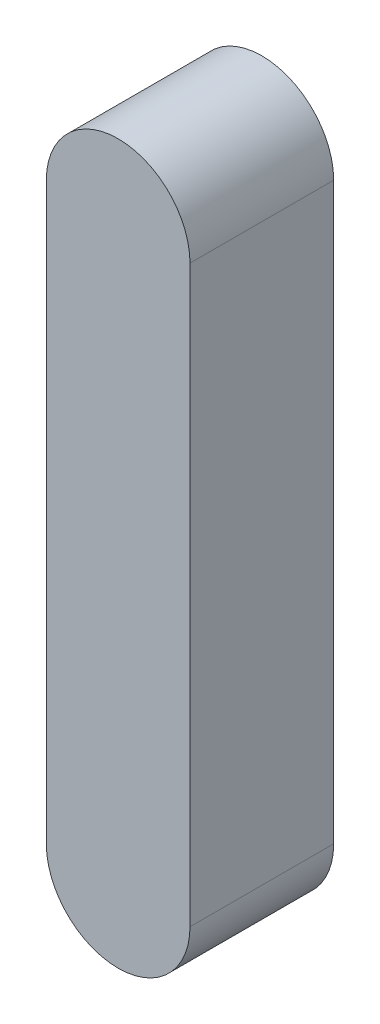
ISO-10303-21;
HEADER;
FILE_DESCRIPTION(('STEP AP214'),'2;1');
FILE_NAME('part.step','',(''),(''),'','','');
FILE_SCHEMA(('AUTOMOTIVE_DESIGN { 1 0 10303 214 1 1 1 1 }'));
ENDSEC;
DATA;
#1=APPLICATION_CONTEXT('core data for automotive mechanical design processes');
#2=APPLICATION_PROTOCOL_DEFINITION('international standard','automotive_design',2000,#1);
#3=PRODUCT_CONTEXT('',#1,'mechanical');
#4=PRODUCT('Part','Part','',(#3));
#5=PRODUCT_RELATED_PRODUCT_CATEGORY('part','',(#4));
#6=PRODUCT_DEFINITION_FORMATION('','',#4);
#7=PRODUCT_DEFINITION_CONTEXT('part definition',#1,'design');
#8=PRODUCT_DEFINITION('design','',#6,#7);
#9=PRODUCT_DEFINITION_SHAPE('','',#8);
#10=(LENGTH_UNIT() NAMED_UNIT(*) SI_UNIT(.MILLI.,.METRE.));
#11=(NAMED_UNIT(*) PLANE_ANGLE_UNIT() SI_UNIT($,.RADIAN.));
#12=(NAMED_UNIT(*) SI_UNIT($,.STERADIAN.) SOLID_ANGLE_UNIT());
#13=UNCERTAINTY_MEASURE_WITH_UNIT(LENGTH_MEASURE(1.E-05),#10,'distance_accuracy_value','');
#14=(GEOMETRIC_REPRESENTATION_CONTEXT(3) GLOBAL_UNCERTAINTY_ASSIGNED_CONTEXT((#13)) GLOBAL_UNIT_ASSIGNED_CONTEXT((#10,
#11,#12)) REPRESENTATION_CONTEXT('',''));
#15=CARTESIAN_POINT('',(0.,0.,0.));
#16=DIRECTION('',(0.,0.,1.));
#17=DIRECTION('',(1.,0.,0.));
#18=AXIS2_PLACEMENT_3D('',#15,#16,#17);
#19=CARTESIAN_POINT('',(0.,-148.,2.));
#20=DIRECTION('',(0.,0.,-1.));
#21=DIRECTION('',(-1.,0.,0.));
#22=AXIS2_PLACEMENT_3D('',#19,#20,#21);
#23=CYLINDRICAL_SURFACE('',#22,1.);
#24=CARTESIAN_POINT('',(0.,-148.,0.));
#25=DIRECTION('',(0.,0.,1.));
#26=DIRECTION('',(1.,0.,0.));
#27=AXIS2_PLACEMENT_3D('',#24,#25,#26);
#28=CIRCLE('',#27,1.);
#29=CARTESIAN_POINT('',(-1.00000000000008,-148.,0.));
#30=VERTEX_POINT('',#29);
#31=CARTESIAN_POINT('',(0.999999999999917,-148.,0.));
#32=VERTEX_POINT('',#31);
#33=EDGE_CURVE('E98',#30,#32,#28,.T.);
#34=ORIENTED_EDGE('',*,*,#33,.T.);
#35=DIRECTION('',(0.,0.,-1.));
#36=VECTOR('',#35,1.);
#37=CARTESIAN_POINT('',(0.999999999999917,-148.,2.));
#38=LINE('',#37,#36);
#39=CARTESIAN_POINT('',(0.999999999999917,-148.,2.));
#40=VERTEX_POINT('',#39);
#41=EDGE_CURVE('E11',#40,#32,#38,.T.);
#42=ORIENTED_EDGE('',*,*,#41,.F.);
#43=CARTESIAN_POINT('',(0.,-148.,2.));
#44=DIRECTION('',(0.,0.,1.));
#45=DIRECTION('',(1.,0.,0.));
#46=AXIS2_PLACEMENT_3D('',#43,#44,#45);
#47=CIRCLE('',#46,1.);
#48=CARTESIAN_POINT('',(-1.00000000000008,-148.,2.));
#49=VERTEX_POINT('',#48);
#50=EDGE_CURVE('E86',#49,#40,#47,.T.);
#51=ORIENTED_EDGE('',*,*,#50,.F.);
#52=DIRECTION('',(0.,0.,-1.));
#53=VECTOR('',#52,1.);
#54=CARTESIAN_POINT('',(-1.00000000000008,-148.,2.));
#55=LINE('',#54,#53);
#56=EDGE_CURVE('E94',#49,#30,#55,.T.);
#57=ORIENTED_EDGE('',*,*,#56,.T.);
#58=EDGE_LOOP('',(#34,#42,#51,#57));
#59=FACE_BOUND('',#58,.T.);
#60=ADVANCED_FACE('F35',(#59),#23,.T.);
#61=CARTESIAN_POINT('',(0.999999999999917,-148.,2.));
#62=DIRECTION('',(-1.,0.,0.));
#63=DIRECTION('',(0.,-1.,0.));
#64=AXIS2_PLACEMENT_3D('',#61,#62,#63);
#65=PLANE('',#64);
#66=DIRECTION('',(0.,1.,0.));
#67=VECTOR('',#66,1.);
#68=CARTESIAN_POINT('',(0.999999999999917,-148.,0.));
#69=LINE('',#68,#67);
#70=CARTESIAN_POINT('',(0.999999999999915,-140.,0.));
#71=VERTEX_POINT('',#70);
#72=EDGE_CURVE('E90',#32,#71,#69,.T.);
#73=ORIENTED_EDGE('',*,*,#72,.T.);
#74=DIRECTION('',(0.,0.,-1.));
#75=VECTOR('',#74,1.);
#76=CARTESIAN_POINT('',(0.999999999999915,-140.,2.));
#77=LINE('',#76,#75);
#78=CARTESIAN_POINT('',(0.999999999999915,-140.,2.));
#79=VERTEX_POINT('',#78);
#80=EDGE_CURVE('E43',#79,#71,#77,.T.);
#81=ORIENTED_EDGE('',*,*,#80,.F.);
#82=DIRECTION('',(0.,1.,0.));
#83=VECTOR('',#82,1.);
#84=CARTESIAN_POINT('',(0.999999999999917,-148.,2.));
#85=LINE('',#84,#83);
#86=EDGE_CURVE('E81',#40,#79,#85,.T.);
#87=ORIENTED_EDGE('',*,*,#86,.F.);
#88=ORIENTED_EDGE('',*,*,#41,.T.);
#89=EDGE_LOOP('',(#73,#81,#87,#88));
#90=FACE_BOUND('',#89,.T.);
#91=ADVANCED_FACE('F89',(#90),#65,.F.);
#92=CARTESIAN_POINT('',(0.,-140.,2.));
#93=DIRECTION('',(0.,0.,-1.));
#94=DIRECTION('',(-1.,0.,0.));
#95=AXIS2_PLACEMENT_3D('',#92,#93,#94);
#96=CYLINDRICAL_SURFACE('',#95,1.);
#97=CARTESIAN_POINT('',(0.,-140.,0.));
#98=DIRECTION('',(0.,0.,1.));
#99=DIRECTION('',(1.,0.,0.));
#100=AXIS2_PLACEMENT_3D('',#97,#98,#99);
#101=CIRCLE('',#100,1.);
#102=CARTESIAN_POINT('',(-1.00000000000008,-140.,0.));
#103=VERTEX_POINT('',#102);
#104=EDGE_CURVE('E68',#71,#103,#101,.T.);
#105=ORIENTED_EDGE('',*,*,#104,.T.);
#106=DIRECTION('',(0.,0.,-1.));
#107=VECTOR('',#106,1.);
#108=CARTESIAN_POINT('',(-1.00000000000008,-140.,2.));
#109=LINE('',#108,#107);
#110=CARTESIAN_POINT('',(-1.00000000000008,-140.,2.));
#111=VERTEX_POINT('',#110);
#112=EDGE_CURVE('E91',#111,#103,#109,.T.);
#113=ORIENTED_EDGE('',*,*,#112,.F.);
#114=CARTESIAN_POINT('',(0.,-140.,2.));
#115=DIRECTION('',(0.,0.,1.));
#116=DIRECTION('',(1.,0.,0.));
#117=AXIS2_PLACEMENT_3D('',#114,#115,#116);
#118=CIRCLE('',#117,1.);
#119=EDGE_CURVE('E84',#79,#111,#118,.T.);
#120=ORIENTED_EDGE('',*,*,#119,.F.);
#121=ORIENTED_EDGE('',*,*,#80,.T.);
#122=EDGE_LOOP('',(#105,#113,#120,#121));
#123=FACE_BOUND('',#122,.T.);
#124=ADVANCED_FACE('F92',(#123),#96,.T.);
#125=CARTESIAN_POINT('',(-1.00000000000008,-140.,2.));
#126=DIRECTION('',(1.,0.,0.));
#127=DIRECTION('',(0.,1.,0.));
#128=AXIS2_PLACEMENT_3D('',#125,#126,#127);
#129=PLANE('',#128);
#130=DIRECTION('',(0.,-1.,0.));
#131=VECTOR('',#130,1.);
#132=CARTESIAN_POINT('',(-1.00000000000008,-140.,0.));
#133=LINE('',#132,#131);
#134=EDGE_CURVE('E74',#103,#30,#133,.T.);
#135=ORIENTED_EDGE('',*,*,#134,.T.);
#136=ORIENTED_EDGE('',*,*,#56,.F.);
#137=DIRECTION('',(0.,-1.,0.));
#138=VECTOR('',#137,1.);
#139=CARTESIAN_POINT('',(-1.00000000000008,-140.,2.));
#140=LINE('',#139,#138);
#141=EDGE_CURVE('E51',#111,#49,#140,.T.);
#142=ORIENTED_EDGE('',*,*,#141,.F.);
#143=ORIENTED_EDGE('',*,*,#112,.T.);
#144=EDGE_LOOP('',(#135,#136,#142,#143));
#145=FACE_BOUND('',#144,.T.);
#146=ADVANCED_FACE('F105',(#145),#129,.F.);
#147=CARTESIAN_POINT('',(0.,-148.,2.));
#148=DIRECTION('',(0.,0.,1.));
#149=DIRECTION('',(1.,0.,0.));
#150=AXIS2_PLACEMENT_3D('',#147,#148,#149);
#151=PLANE('',#150);
#152=ORIENTED_EDGE('',*,*,#50,.T.);
#153=ORIENTED_EDGE('',*,*,#86,.T.);
#154=ORIENTED_EDGE('',*,*,#119,.T.);
#155=ORIENTED_EDGE('',*,*,#141,.T.);
#156=EDGE_LOOP('',(#152,#153,#154,#155));
#157=FACE_BOUND('',#156,.T.);
#158=ADVANCED_FACE('F82',(#157),#151,.T.);
#159=CARTESIAN_POINT('',(0.,-148.,0.));
#160=DIRECTION('',(0.,0.,1.));
#161=DIRECTION('',(1.,0.,0.));
#162=AXIS2_PLACEMENT_3D('',#159,#160,#161);
#163=PLANE('',#162);
#164=ORIENTED_EDGE('',*,*,#33,.F.);
#165=ORIENTED_EDGE('',*,*,#134,.F.);
#166=ORIENTED_EDGE('',*,*,#104,.F.);
#167=ORIENTED_EDGE('',*,*,#72,.F.);
#168=EDGE_LOOP('',(#164,#165,#166,#167));
#169=FACE_BOUND('',#168,.T.);
#170=ADVANCED_FACE('F108',(#169),#163,.F.);
#171=CLOSED_SHELL('',(#60,#91,#124,#146,#158,#170));
#172=MANIFOLD_SOLID_BREP('B2',#171);
#173=ADVANCED_BREP_SHAPE_REPRESENTATION('',(#18,#172),#14);
#174=SHAPE_DEFINITION_REPRESENTATION(#9,#173);
ENDSEC;
END-ISO-10303-21;
